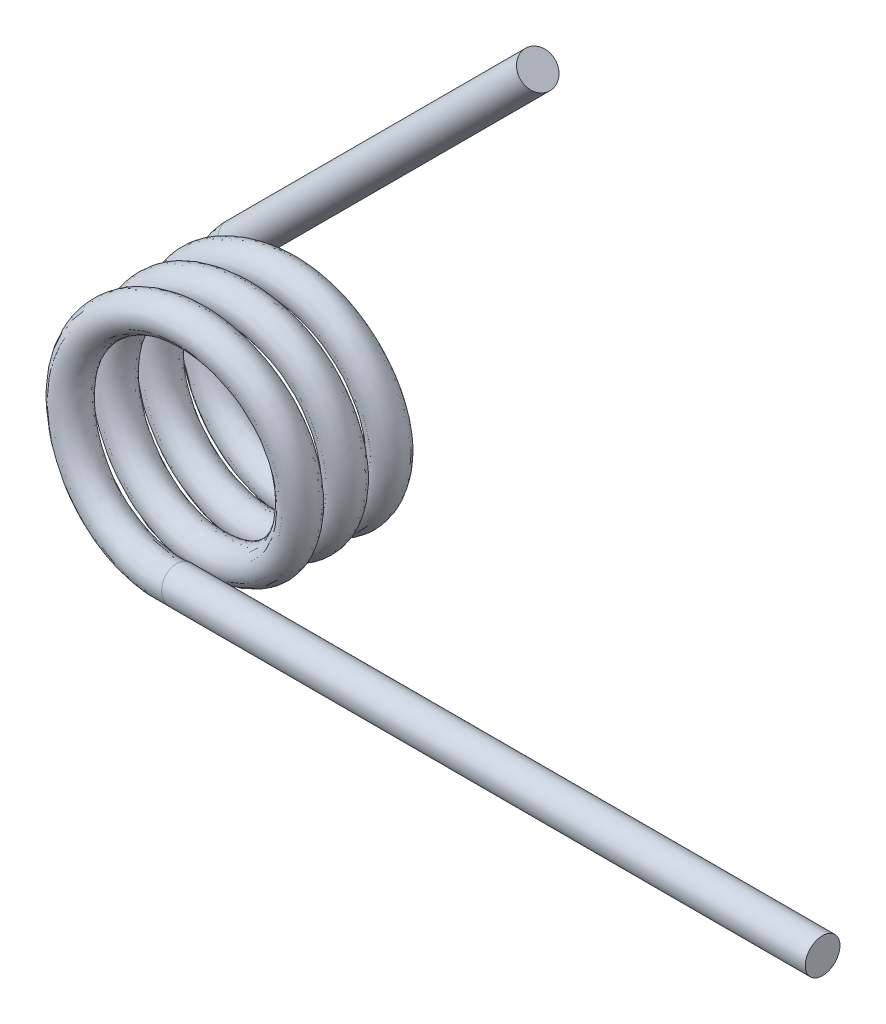
ISO-10303-21;
HEADER;
FILE_DESCRIPTION(('STEP AP214'),'2;1');
FILE_NAME('part.step','',(''),(''),'','','');
FILE_SCHEMA(('AUTOMOTIVE_DESIGN { 1 0 10303 214 1 1 1 1 }'));
ENDSEC;
DATA;
#1=APPLICATION_CONTEXT('core data for automotive mechanical design processes');
#2=APPLICATION_PROTOCOL_DEFINITION('international standard','automotive_design',2000,#1);
#3=PRODUCT_CONTEXT('',#1,'mechanical');
#4=PRODUCT('Part','Part','',(#3));
#5=PRODUCT_RELATED_PRODUCT_CATEGORY('part','',(#4));
#6=PRODUCT_DEFINITION_FORMATION('','',#4);
#7=PRODUCT_DEFINITION_CONTEXT('part definition',#1,'design');
#8=PRODUCT_DEFINITION('design','',#6,#7);
#9=PRODUCT_DEFINITION_SHAPE('','',#8);
#10=(LENGTH_UNIT() NAMED_UNIT(*) SI_UNIT(.MILLI.,.METRE.));
#11=(NAMED_UNIT(*) PLANE_ANGLE_UNIT() SI_UNIT($,.RADIAN.));
#12=(NAMED_UNIT(*) SI_UNIT($,.STERADIAN.) SOLID_ANGLE_UNIT());
#13=UNCERTAINTY_MEASURE_WITH_UNIT(LENGTH_MEASURE(1.E-05),#10,'distance_accuracy_value','');
#14=(GEOMETRIC_REPRESENTATION_CONTEXT(3) GLOBAL_UNCERTAINTY_ASSIGNED_CONTEXT((#13)) GLOBAL_UNIT_ASSIGNED_CONTEXT((#10,
#11,#12)) REPRESENTATION_CONTEXT('',''));
#15=CARTESIAN_POINT('',(0.,0.,0.));
#16=DIRECTION('',(0.,0.,1.));
#17=DIRECTION('',(1.,0.,0.));
#18=AXIS2_PLACEMENT_3D('',#15,#16,#17);
#19=CARTESIAN_POINT('',(18.6300268586095,-2.8765772246113,4.255));
#20=DIRECTION('',(1.,0.,0.));
#21=DIRECTION('',(0.,0.,-1.));
#22=AXIS2_PLACEMENT_3D('',#19,#20,#21);
#23=PLANE('',#22);
#24=CARTESIAN_POINT('',(18.6300268586095,-2.8765772246113,4.255));
#25=DIRECTION('',(1.,0.,0.));
#26=DIRECTION('',(0.,0.,-1.));
#27=AXIS2_PLACEMENT_3D('',#24,#25,#26);
#28=CIRCLE('',#27,0.4895);
#29=CARTESIAN_POINT('',(18.6300268586095,-2.8765772246113,3.7655));
#30=VERTEX_POINT('',#29);
#31=EDGE_CURVE('E63',#30,#30,#28,.T.);
#32=ORIENTED_EDGE('',*,*,#31,.T.);
#33=EDGE_LOOP('',(#32));
#34=FACE_BOUND('',#33,.T.);
#35=ADVANCED_FACE('F39',(#34),#23,.T.);
#36=CARTESIAN_POINT('',(6.34628336114918,10.4828580310906,0.));
#37=DIRECTION('',(-0.707106781186541,-0.707106781186554,0.));
#38=DIRECTION('',(-0.00427329936230746,0.00427329936230736,-0.999981738745827));
#39=AXIS2_PLACEMENT_3D('',#36,#37,#38);
#40=PLANE('',#39);
#41=CARTESIAN_POINT('',(6.34628336114918,10.4828580310906,0.));
#42=DIRECTION('',(-0.707106781186541,-0.707106781186554,0.));
#43=DIRECTION('',(-0.00427329936230746,0.00427329936230736,-0.999981738745827));
#44=AXIS2_PLACEMENT_3D('',#41,#42,#43);
#45=CIRCLE('',#44,0.4895);
#46=CARTESIAN_POINT('',(6.34419158111133,10.4849498111285,-0.489491061116082));
#47=VERTEX_POINT('',#46);
#48=EDGE_CURVE('E48',#47,#47,#45,.T.);
#49=ORIENTED_EDGE('',*,*,#48,.F.);
#50=EDGE_LOOP('',(#49));
#51=FACE_BOUND('',#50,.T.);
#52=ADVANCED_FACE('F75',(#51),#40,.F.);
#53=CARTESIAN_POINT('',(0.530026858609534,-2.8765772246113,4.255));
#54=DIRECTION('',(1.,0.,0.));
#55=DIRECTION('',(0.,0.,-1.));
#56=AXIS2_PLACEMENT_3D('',#53,#54,#55);
#57=CYLINDRICAL_SURFACE('',#56,0.4895);
#58=ORIENTED_EDGE('',*,*,#31,.F.);
#59=EDGE_LOOP('',(#58));
#60=FACE_BOUND('',#59,.T.);
#61=CARTESIAN_POINT('',(0.530026858609544,-2.8765772246113,4.255));
#62=DIRECTION('',(0.981178342847991,0.180788080481897,0.0678581570759287));
#63=DIRECTION('',(0.0678581570759287,0.00619224715790136,-0.997675762256152));
#64=AXIS2_PLACEMENT_3D('',#61,#62,#63);
#65=CIRCLE('',#64,0.4895);
#66=CARTESIAN_POINT('',(0.563243426498211,-2.87354611962751,3.76663771437562));
#67=VERTEX_POINT('',#66);
#68=EDGE_CURVE('E42',#67,#67,#65,.T.);
#69=ORIENTED_EDGE('',*,*,#68,.T.);
#70=EDGE_LOOP('',(#69));
#71=FACE_BOUND('',#70,.T.);
#72=ADVANCED_FACE('F77',(#60,#71),#57,.T.);
#73=CARTESIAN_POINT('',(-2.0938663464962,2.0468918835208,-0.488362773792839));
#74=CARTESIAN_POINT('',(-2.36763342569434,1.76698969350322,-0.461760612571226));
#75=CARTESIAN_POINT('',(-2.57930809249891,1.43762669824452,-0.435682391474214));
#76=CARTESIAN_POINT('',(-3.15249778585969,-0.00102496778021607,-0.330430426000548));
#77=CARTESIAN_POINT('',(-2.85782242619199,-1.32220134997787,-0.251926776694797));
#78=CARTESIAN_POINT('',(-1.25203658348134,-2.85101502267109,-0.101270119622918));
#79=CARTESIAN_POINT('',(-0.0604242902565774,-3.11369932529708,-0.0286574805579852));
#80=CARTESIAN_POINT('',(2.13432822452708,-2.36639687762337,0.128869944572521));
#81=CARTESIAN_POINT('',(2.98130588913432,-1.11939078305545,0.21448154326887));
#82=CARTESIAN_POINT('',(2.87345510542524,1.28654657242071,0.378134932126369));
#83=CARTESIAN_POINT('',(2.05808697179071,2.38071671336757,0.457593503653895));
#84=CARTESIAN_POINT('',(-0.119138685124309,3.14536577666903,0.614400189575746));
#85=CARTESIAN_POINT('',(-1.43715794829883,2.80172127515322,0.693654117318446));
#86=CARTESIAN_POINT('',(-2.96587828050796,1.05967502675516,0.851147056295941));
#87=CARTESIAN_POINT('',(-3.13848898695276,-0.281783258475423,0.929619655257181));
#88=CARTESIAN_POINT('',(-2.08753667374326,-2.36127644816065,1.08794717106365));
#89=CARTESIAN_POINT('',(-0.913493025789077,-3.01698691823009,1.16578595403689));
#90=CARTESIAN_POINT('',(1.41414642293534,-2.81794700477442,1.3245318632749));
#91=CARTESIAN_POINT('',(2.45816323923827,-1.9723965030003,1.40226748309654));
#92=CARTESIAN_POINT('',(3.14171996712435,0.25821616377214,1.56080033938955));
#93=CARTESIAN_POINT('',(2.7433028005917,1.54746229749711,1.63901849602975));
#94=CARTESIAN_POINT('',(0.937723758925465,3.0074414679008,1.79680354292195));
#95=CARTESIAN_POINT('',(-0.416875224311723,3.11971412106547,1.87582502716098));
#96=CARTESIAN_POINT('',(-2.35046699324849,2.04244927330612,2.0262329726745));
#97=CARTESIAN_POINT('',(-2.9552146592131,0.982596397929943,2.09884259374825));
#98=CARTESIAN_POINT('',(-2.89357061012604,-1.33507673320053,2.25636986962714));
#99=CARTESIAN_POINT('',(-1.95443834232406,-2.51423770137044,2.34198154492577));
#100=CARTESIAN_POINT('',(0.374942016447505,-3.12591822351663,2.50563493084736));
#101=CARTESIAN_POINT('',(1.66192457148714,-2.67236613698577,2.5850935036745));
#102=CARTESIAN_POINT('',(3.03878740385889,-0.820543118788447,2.74190018955335));
#103=CARTESIAN_POINT('',(3.10215997265134,0.540063448501195,2.82115411699546));
#104=CARTESIAN_POINT('',(1.89283534980621,2.51724437554665,2.97864704910346));
#105=CARTESIAN_POINT('',(0.663196717179051,3.08053351579807,3.05711969521312));
#106=CARTESIAN_POINT('',(-1.63461243445009,2.69471215925458,3.21544703659947));
#107=CARTESIAN_POINT('',(-2.60946739310408,1.7684308205641,3.29328490837826));
#108=CARTESIAN_POINT('',(-3.11124349417794,-0.515234164071165,3.45216947848876));
#109=CARTESIAN_POINT('',(-2.60851799490417,-1.76452225700017,3.53018542597519));
#110=CARTESIAN_POINT('',(-1.01468846748341,-2.8529502482395,3.66131311683812));
#111=CARTESIAN_POINT('',(-0.205625051166704,-3.02404320636376,3.71339912367885));
#112=CARTESIAN_POINT('',(0.56324342649821,-2.87354611962751,3.76663771437562));
#113=CARTESIAN_POINT('',(-1.91271137806017,1.86558827132122,-0.489908125800683));
#114=CARTESIAN_POINT('',(-2.16164651245068,1.61049761825705,-0.46341680810756));
#115=CARTESIAN_POINT('',(-2.35529702666768,1.30850063629937,-0.437133681168645));
#116=CARTESIAN_POINT('',(-2.87609209441093,-0.00284212051756129,-0.332400221105445));
#117=CARTESIAN_POINT('',(-2.60538720750368,-1.21030911165802,-0.253234696870722));
#118=CARTESIAN_POINT('',(-1.14040320484488,-2.60195615883937,-0.103063555250952));
#119=CARTESIAN_POINT('',(-0.0519531541739385,-2.84124303274397,-0.0302276290921996));
#120=CARTESIAN_POINT('',(1.95024747857444,-2.1569801974874,0.127364439607384));
#121=CARTESIAN_POINT('',(2.72144800732195,-1.01690606579414,0.213205811403368));
#122=CARTESIAN_POINT('',(2.62071749961187,1.17557077207754,0.37630070991663));
#123=CARTESIAN_POINT('',(1.87424665379275,2.17489828790497,0.456294821951415));
#124=CARTESIAN_POINT('',(-0.110686160210887,2.86952939701158,0.612566389133459));
#125=CARTESIAN_POINT('',(-1.31513068835853,2.55401477617731,0.692356517049048));
#126=CARTESIAN_POINT('',(-2.70651989239745,0.964894716470479,0.849312073128396));
#127=CARTESIAN_POINT('',(-2.86289266654269,-0.261545599078676,0.928323500470885));
#128=CARTESIAN_POINT('',(-1.90302325065485,-2.15556886815268,1.08611078378463));
#129=CARTESIAN_POINT('',(-0.829093891905757,-2.75374526957869,1.1644905974633));
#130=CARTESIAN_POINT('',(1.29193571881643,-2.56999151450873,1.32269476918038));
#131=CARTESIAN_POINT('',(2.24543121701114,-1.79594574801056,1.40097178505933));
#132=CARTESIAN_POINT('',(2.86610685250119,0.237557759130508,1.55896368152844));
#133=CARTESIAN_POINT('',(2.5005588329176,1.41568122634267,1.63772154058003));
#134=CARTESIAN_POINT('',(0.85360961957822,2.74436052959318,1.79496822285864));
#135=CARTESIAN_POINT('',(-0.384759293436816,2.84557971317633,1.87452668234068));
#136=CARTESIAN_POINT('',(-2.14579224530378,1.86187939018211,2.02442136573558));
#137=CARTESIAN_POINT('',(-2.69757205612254,0.893576817124477,2.09727160978748));
#138=CARTESIAN_POINT('',(-2.63892644891741,-1.22150989155184,2.25486526476646));
#139=CARTESIAN_POINT('',(-1.77939073572622,-2.29655084149123,2.34070581451554));
#140=CARTESIAN_POINT('',(0.344048745140703,-2.85162362034263,2.50380070104746));
#141=CARTESIAN_POINT('',(1.52000407335801,-2.4356869046004,2.58379482198591));
#142=CARTESIAN_POINT('',(2.7728902732702,-0.746679260821541,2.7400663891396));
#143=CARTESIAN_POINT('',(2.82938665021835,0.497123073211611,2.81985651874263));
#144=CARTESIAN_POINT('',(1.72529275916328,2.29774595081289,2.97681206538323));
#145=CARTESIAN_POINT('',(0.600657404817982,2.81136494116315,3.05582336270667));
#146=CARTESIAN_POINT('',(-1.49299787585572,2.45742310282239,3.213610724988));
#147=CARTESIAN_POINT('',(-2.38317762355383,1.60964196088404,3.29199577523885));
#148=CARTESIAN_POINT('',(-2.83813638944651,-0.47200931920661,3.45032914150828));
#149=CARTESIAN_POINT('',(-2.37740141254255,-1.61345103311367,3.52880468599672));
#150=CARTESIAN_POINT('',(-0.923496194654531,-2.6039366984286,3.65959692027169));
#151=CARTESIAN_POINT('',(-0.184252270281751,-2.75954017236415,3.71193783252807));
#152=CARTESIAN_POINT('',(0.516907152091288,-2.62147283397314,3.76505063151739));
#153=CARTESIAN_POINT('',(-1.73569996977945,1.71082030980437,-0.258657555336103));
#154=CARTESIAN_POINT('',(-1.96336073003026,1.47990903093087,-0.23226717436363));
#155=CARTESIAN_POINT('',(-2.14235716707522,1.20417292472552,-0.205797438579681));
#156=CARTESIAN_POINT('',(-2.62261736638395,0.012426811857812,-0.101538207095982));
#157=CARTESIAN_POINT('',(-2.3813791876143,-1.09246239529204,-0.0217667774984298));
#158=CARTESIAN_POINT('',(-1.05344888506516,-2.36692478415878,0.127959700359682));
#159=CARTESIAN_POINT('',(-0.0610227120771452,-2.59130830002005,0.201000784898506));
#160=CARTESIAN_POINT('',(1.76882537752534,-1.97669732362203,0.358650770837577));
#161=CARTESIAN_POINT('',(2.47750727291636,-0.939128680220442,0.44470305244782));
#162=CARTESIAN_POINT('',(2.39596967938059,1.05836736879257,0.60728669074003));
#163=CARTESIAN_POINT('',(1.7187506728459,1.97536646740859,0.687771053348321));
#164=CARTESIAN_POINT('',(-0.0859980725996869,2.61732059826558,0.843552756632553));
#165=CARTESIAN_POINT('',(-1.18831125927818,2.33496084919071,0.923833737558957));
#166=CARTESIAN_POINT('',(-2.463066951354,0.893985286460996,1.08029735878935));
#167=CARTESIAN_POINT('',(-2.61207966560256,-0.226109468439607,1.15980204425497));
#168=CARTESIAN_POINT('',(-1.74660129253814,-1.95576038241741,1.3170947840441));
#169=CARTESIAN_POINT('',(-0.768071788020467,-2.50780549142793,1.39596987306248));
#170=CARTESIAN_POINT('',(1.16473308216294,-2.35031299120139,1.55367812129217));
#171=CARTESIAN_POINT('',(2.0400327091914,-1.64763268804902,1.63245074944741));
#172=CARTESIAN_POINT('',(2.61485053845901,0.201701615452943,1.78994743160695));
#173=CARTESIAN_POINT('',(2.28664288343039,1.28024640518931,1.86919935428674));
#174=CARTESIAN_POINT('',(0.792701207041617,2.49815194977488,2.02595319720638));
#175=CARTESIAN_POINT('',(-0.338547827893222,2.59683217358306,2.10600322351708));
#176=CARTESIAN_POINT('',(-1.94717469263065,1.70902790948982,2.25542804856905));
#177=CARTESIAN_POINT('',(-2.45622343296831,0.827996045993654,2.32849925992074));
#178=CARTESIAN_POINT('',(-2.41289166465284,-1.10182779507024,2.48615242272121));
#179=CARTESIAN_POINT('',(-1.63266333862859,-2.08672359863677,2.57220305678615));
#180=CARTESIAN_POINT('',(0.298894827420089,-2.60220560667885,2.73478667497783));
#181=CARTESIAN_POINT('',(1.37566698469447,-2.22794005780839,2.81527105339683));
#182=CARTESIAN_POINT('',(2.52473164479271,-0.695336540046456,2.97105275666385));
#183=CARTESIAN_POINT('',(2.58254918096621,0.441095821282932,3.05133374111085));
#184=CARTESIAN_POINT('',(1.58526820443052,2.0863444278407,3.20779735051642));
#185=CARTESIAN_POINT('',(0.559992266535262,2.56134634493135,3.28730174294235));
#186=CARTESIAN_POINT('',(-1.34867182081602,2.24870992396111,3.44459479610573));
#187=CARTESIAN_POINT('',(-2.16646987213281,1.47831625390584,3.52348077597312));
#188=CARTESIAN_POINT('',(-2.59055914127107,-0.415631808474069,3.68130947017576));
#189=CARTESIAN_POINT('',(-2.17525984626743,-1.46102755337379,3.76020556519815));
#190=CARTESIAN_POINT('',(-0.855315111816955,-2.37024593988615,3.89069135978841));
#191=CARTESIAN_POINT('',(-0.181068547695663,-2.51618605765498,3.9432308918658));
#192=CARTESIAN_POINT('',(0.458923247489737,-2.39356562855337,3.99626300021489));
#193=CARTESIAN_POINT('',(-1.70891369154788,1.73322557416939,0.252754745475336));
#194=CARTESIAN_POINT('',(-1.93947548093307,1.50583999575423,0.279142465996874));
#195=CARTESIAN_POINT('',(-2.12230724498259,1.23309792163392,0.305615057101753));
#196=CARTESIAN_POINT('',(-2.6182552978191,0.0496243992379974,0.409868877637214));
#197=CARTESIAN_POINT('',(-2.3938481829686,-1.05720305240902,0.489648423419006));
#198=CARTESIAN_POINT('',(-1.08557769794335,-2.34841017039694,0.639368498076639));
#199=CARTESIAN_POINT('',(-0.097901160596224,-2.58682884610208,0.712413975687198));
#200=CARTESIAN_POINT('',(1.73819532519746,-1.99924332281224,0.870061984804301));
#201=CARTESIAN_POINT('',(2.46100665710745,-0.973132375063701,0.956118329940038));
#202=CARTESIAN_POINT('',(2.40741726276449,1.02268924346681,1.11869512634797));
#203=CARTESIAN_POINT('',(1.74462905871406,1.94840403876247,1.19918604832843));
#204=CARTESIAN_POINT('',(-0.0486351995883971,2.61460259847011,1.35496119867074));
#205=CARTESIAN_POINT('',(-1.15359866275751,2.34886220491895,1.43524874388262));
#206=CARTESIAN_POINT('',(-2.44663958722763,0.927676909092079,1.5917057882453));
#207=CARTESIAN_POINT('',(-2.61194970912424,-0.188691139342879,1.67121706835703));
#208=CARTESIAN_POINT('',(-1.77179045924972,-1.92796811337153,1.82850319622795));
#209=CARTESIAN_POINT('',(-0.802734804914021,-2.49367822723435,1.9073849093758));
#210=CARTESIAN_POINT('',(1.1295450293411,-2.36333937808632,2.06508652238322));
#211=CARTESIAN_POINT('',(2.01400166212738,-1.67452102835436,2.14386578459801));
#212=CARTESIAN_POINT('',(2.61377970525409,0.164201528530117,2.30135583502232));
#213=CARTESIAN_POINT('',(2.30191318080836,1.24610357573387,2.38061437490069));
#214=CARTESIAN_POINT('',(0.827044144579985,2.48311240065352,2.53736161614438));
#215=CARTESIAN_POINT('',(-0.301200325280759,2.59831856944755,2.61741822567233));
#216=CARTESIAN_POINT('',(-1.91993459947434,1.73417841274055,2.76683675959064));
#217=CARTESIAN_POINT('',(-2.44099008838572,0.8618793586765,2.8399124424963));
#218=CARTESIAN_POINT('',(-2.42532342910359,-1.06588323268243,2.99756365373594));
#219=CARTESIAN_POINT('',(-1.66023089432619,-2.06086723829129,3.08361833406358));
#220=CARTESIAN_POINT('',(0.261426645983301,-2.60253859588495,3.2461951106138));
#221=CARTESIAN_POINT('',(1.34223456087372,-2.24464144848416,3.32668604837757));
#222=CARTESIAN_POINT('',(2.51103799632869,-0.73020566386847,3.48246119870267));
#223=CARTESIAN_POINT('',(2.58551201180306,0.403820714964622,3.56274874748643));
#224=CARTESIAN_POINT('',(1.61255952769664,2.06065070591953,3.7192057799174));
#225=CARTESIAN_POINT('',(0.595683141919077,2.55010711127671,3.79871676298107));
#226=CARTESIAN_POINT('',(-1.31465177139353,2.26450682760301,3.95600321271201));
#227=CARTESIAN_POINT('',(-2.1426949961118,1.50722141804533,4.03489595007606));
#228=CARTESIAN_POINT('',(-2.59256339756413,-0.378155722702984,4.1927177110808));
#229=CARTESIAN_POINT('',(-2.19315713955649,-1.42812154502819,4.27161904190298));
#230=CARTESIAN_POINT('',(-0.887827954109313,-2.35458756275449,4.4021021517186));
#231=CARTESIAN_POINT('',(-0.216823266073335,-2.51025178050436,4.45463092878438));
#232=CARTESIAN_POINT('',(0.424138938937568,-2.39673979426982,4.50767478981753));
#233=CARTESIAN_POINT('',(-1.86155335500911,1.90837917422089,0.486817421784996));
#234=CARTESIAN_POINT('',(-2.11602482289003,1.66002393354117,0.513303473906599));
#235=CARTESIAN_POINT('',(-2.31700449615243,1.36374331114223,0.539592238591511));
#236=CARTESIAN_POINT('',(-2.8677611571189,0.0682000383137258,0.644315364503996));
#237=CARTESIAN_POINT('',(-2.62920123445589,-1.14296872713713,0.723496389509345));
#238=CARTESIAN_POINT('',(-1.20176471746786,-2.56659585124452,0.873655301917157));
#239=CARTESIAN_POINT('',(-0.12238580267888,-2.8326879059431,0.946499618224684));
#240=CARTESIAN_POINT('',(1.89174838775325,-2.20003988410433,1.10408791147273));
#241=CARTESIAN_POINT('',(2.689934152481,-1.08184833920788,1.18993704403149));
#242=CARTESIAN_POINT('',(2.64258077339626,1.10743057200868,1.35301887550654));
#243=CARTESIAN_POINT('',(1.92367073014806,2.12340384234342,1.43302551501936));
#244=CARTESIAN_POINT('',(-0.0393283290699674,2.86433839977836,1.58928456700595));
#245=CARTESIAN_POINT('',(-1.24883451247021,2.58056440993261,1.66908723178203));
#246=CARTESIAN_POINT('',(-2.67514593796774,1.02924097586342,1.82603022697016));
#247=CARTESIAN_POINT('',(-2.86264446795129,-0.190081854623129,1.90505424915835));
#248=CARTESIAN_POINT('',(-1.9511310153895,-2.10248954417173,2.06282890463887));
#249=CARTESIAN_POINT('',(-0.895295377671533,-2.72676418243382,2.1412213694716));
#250=CARTESIAN_POINT('',(1.22473148827666,-2.5948700808687,2.29941286884988));
#251=CARTESIAN_POINT('',(2.19571557924286,-1.8472986952666,2.37770255484869));
#252=CARTESIAN_POINT('',(2.86406171172681,0.165937868731229,2.53568178563537));
#253=CARTESIAN_POINT('',(2.52972295264003,1.35047322539631,2.61445228260683));
#254=CARTESIAN_POINT('',(0.919199798812371,2.71563710657737,2.7716863566112));
#255=CARTESIAN_POINT('',(-0.313430817606863,2.84841852016765,2.85125738911196));
#256=CARTESIAN_POINT('',(-2.09376749958588,1.90991331314477,3.00114005732862));
#257=CARTESIAN_POINT('',(-2.66847851104117,0.958289177548453,3.07399884141844));
#258=CARTESIAN_POINT('',(-2.66266937008131,-1.15286083417907,3.23158876919109));
#259=CARTESIAN_POINT('',(-1.83204088882639,-2.24716883077956,3.31743704673349));
#260=CARTESIAN_POINT('',(0.272489789730017,-2.85225958287994,3.48051886669087));
#261=CARTESIAN_POINT('',(1.45615284723034,-2.4675842111929,3.56052551505606));
#262=CARTESIAN_POINT('',(2.74673733116635,-0.813274381830415,3.7167845670123));
#263=CARTESIAN_POINT('',(2.83504524029673,0.4259328641117,3.79658723357458));
#264=CARTESIAN_POINT('',(1.77741534717953,2.24867455661259,3.9535302191202));
#265=CARTESIAN_POINT('',(0.668821955710277,2.78989958605012,4.0325541036348));
#266=CARTESIAN_POINT('',(-1.42802436750286,2.48759296642488,4.19032885428739));
#267=CARTESIAN_POINT('',(-2.33777095507286,1.6648467579338,4.26872681040668));
#268=CARTESIAN_POINT('',(-2.84196423700095,-0.400435267633742,4.42704693524427));
#269=CARTESIAN_POINT('',(-2.41158272488076,-1.55060518648679,4.5055324793726));
#270=CARTESIAN_POINT('',(-0.985591149432634,-2.57403140097259,4.63631958610695));
#271=CARTESIAN_POINT('',(-0.252537901463087,-2.74824822812606,4.68864202056187));
#272=CARTESIAN_POINT('',(0.450474016313953,-2.62753504394072,4.74177520276617));
#273=CARTESIAN_POINT('',(-2.22386329188117,2.27098639862005,0.489908125800685));
#274=CARTESIAN_POINT('',(-2.52799157346847,1.97301113269112,0.516615694565348));
#275=CARTESIAN_POINT('',(-2.76502662781489,1.62199543503252,0.542494817980538));
#276=CARTESIAN_POINT('',(-3.42057254001641,0.0718343437884159,0.648254954713285));
#277=CARTESIAN_POINT('',(-3.1340716718325,-1.36675320377683,0.726112229861697));
#278=CARTESIAN_POINT('',(-1.42503147474077,-3.06471357890795,0.877242173172767));
#279=CARTESIAN_POINT('',(-0.139328074844158,-3.37760049104932,0.949639915293113));
#280=CARTESIAN_POINT('',(2.25990987965853,-2.61887324437628,1.107098921403));
#281=CARTESIAN_POINT('',(3.20964991610573,-1.28681777373049,1.19248850776195));
#282=CARTESIAN_POINT('',(3.148055985023,1.32938217269502,1.35668731992652));
#283=CARTESIAN_POINT('',(2.29135136614396,2.53504069326863,1.43562287842383));
#284=CARTESIAN_POINT('',(-0.0562333788968112,3.41601115909327,1.59295216789103));
#285=CARTESIAN_POINT('',(-1.49288903235082,3.07597740788443,1.67168243232032));
#286=CARTESIAN_POINT('',(-3.19386271418877,1.21880159643278,1.82970019330575));
#287=CARTESIAN_POINT('',(-3.41383710877141,-0.230557173416624,1.90764655873045));
#288=CARTESIAN_POINT('',(-2.32015786156632,-2.51390470418767,2.06650167919741));
#289=CARTESIAN_POINT('',(-1.06409364543817,-3.25324747973662,2.14381208261879));
#290=CARTESIAN_POINT('',(1.46915289651447,-3.09078106140007,2.30308705703892));
#291=CARTESIAN_POINT('',(2.62117962369712,-2.20020020524607,2.38029395092311));
#292=CARTESIAN_POINT('',(3.41528794097314,0.207254678014491,2.53935510135758));
#293=CARTESIAN_POINT('',(3.01521088798822,1.61403536770521,2.61704619350628));
#294=CARTESIAN_POINT('',(1.08742807750686,3.24179898319261,2.77535699673781));
#295=CARTESIAN_POINT('',(-0.377662679356677,3.39668733594592,2.85385407875306));
#296=CARTESIAN_POINT('',(-2.50311699547531,2.2710530793928,3.00476327120599));
#297=CARTESIAN_POINT('',(-3.18376371722229,1.13632833915938,3.07714080934089));
#298=CARTESIAN_POINT('',(-3.17195769249858,-1.37999451747645,3.23459797891136));
#299=CARTESIAN_POINT('',(-2.18213610202205,-2.68254255053851,3.31998850755396));
#300=CARTESIAN_POINT('',(0.334276332343621,-3.40084878922744,3.48418732629068));
#301=CARTESIAN_POINT('',(1.7399938434886,-2.94094267596362,3.56312287843324));
#302=CARTESIAN_POINT('',(3.27853159234373,-0.961002097764227,3.72045216783979));
#303=CARTESIAN_POINT('',(3.3805918851627,0.511813614690869,3.79918243008072));
#304=CARTESIAN_POINT('',(2.11250052846539,2.6876714060801,3.95720018656015));
#305=CARTESIAN_POINT('',(0.793900580432415,3.32823673531969,4.03514676864719));
#306=CARTESIAN_POINT('',(-1.71125348469158,2.96217107928949,4.19400147751083));
#307=CARTESIAN_POINT('',(-2.79035049417336,1.98242447729392,4.2713050766855));
#308=CARTESIAN_POINT('',(-3.3881784464638,-0.486884957362851,4.43072760920524));
#309=CARTESIAN_POINT('',(-2.87381588960401,-1.85274763425978,4.50829395932903));
#310=CARTESIAN_POINT('',(-1.1679756950904,-3.07205850059437,4.63975197924014));
#311=CARTESIAN_POINT('',(-0.295282029343233,-3.27732407870221,4.69156813675991));
#312=CARTESIAN_POINT('',(0.543146565127797,-3.13168161524947,4.74494936848261));
#313=CARTESIAN_POINT('',(-2.40087470016189,2.4257543601369,0.258657555336104));
#314=CARTESIAN_POINT('',(-2.72627721545108,2.10360013142994,0.28546806411756));
#315=CARTESIAN_POINT('',(-2.97796648740735,1.72632314660704,0.311158575391242));
#316=CARTESIAN_POINT('',(-3.67404726804339,0.0565654114110313,0.417392940704828));
#317=CARTESIAN_POINT('',(-3.35807969172188,-1.48459992014281,0.494644310487898));
#318=CARTESIAN_POINT('',(-1.51198579452049,-3.29974495358854,0.646218917563505));
#319=CARTESIAN_POINT('',(-0.130258516940952,-3.6275352237737,0.718411501301485));
#320=CARTESIAN_POINT('',(2.44133198070764,-2.7991561182411,0.875812590173903));
#321=CARTESIAN_POINT('',(3.45359065051132,-1.36459515930202,0.96099126671804));
#322=CARTESIAN_POINT('',(3.37280380525428,1.44658557597798,1.12570133910262));
#323=CARTESIAN_POINT('',(2.44684734709082,2.734572513765,1.20414664702692));
#324=CARTESIAN_POINT('',(-0.0809214665080115,3.66821995783927,1.36196580039193));
#325=CARTESIAN_POINT('',(-1.61970846143317,3.29503133487003,1.44020521181092));
#326=CARTESIAN_POINT('',(-3.43731565523022,1.28971102644327,1.5987149076443));
#327=CARTESIAN_POINT('',(-3.66465010971255,-0.26599330405368,1.67616801494687));
#328=CARTESIAN_POINT('',(-2.47657981968203,-2.71371318992495,1.83551767893744));
#329=CARTESIAN_POINT('',(-1.12511574931944,-3.49918725788814,1.9123328070186));
#330=CARTESIAN_POINT('',(1.59635553316394,-3.31045958470667,2.07210370492814));
#331=CARTESIAN_POINT('',(2.82657813151686,-2.34851326520561,2.14881498653502));
#332=CARTESIAN_POINT('',(3.66654425501531,0.243110821690046,2.30837135127907));
#333=CARTESIAN_POINT('',(3.22912683747443,1.74947018885857,2.38556837980007));
#334=CARTESIAN_POINT('',(1.14833649004447,3.48800756301091,2.54437202238957));
#335=CARTESIAN_POINT('',(-0.423874144902276,3.64543487553869,2.62237753757666));
#336=CARTESIAN_POINT('',(-2.70173454814661,2.42390456008554,2.77375658837252));
#337=CARTESIAN_POINT('',(-3.42511234037629,1.2019091102902,2.84591315920625));
#338=CARTESIAN_POINT('',(-3.39799247676342,-1.49967661395805,3.00331082095825));
#339=CARTESIAN_POINT('',(-2.32886349911968,-2.89236979339298,3.08849126528389));
#340=CARTESIAN_POINT('',(0.379430250064235,-3.65026680289122,3.25320135235981));
#341=CARTESIAN_POINT('',(1.88433093215314,-3.14868952275563,3.33164664702281));
#342=CARTESIAN_POINT('',(3.52669022082022,-1.01234481853931,3.48946580031504));
#343=CARTESIAN_POINT('',(3.62742935441384,0.567840866619547,3.5677052077125));
#344=CARTESIAN_POINT('',(2.25252508319915,2.89907292905229,3.72621490142696));
#345=CARTESIAN_POINT('',(0.834565718717144,3.57825533155149,3.80366838841252));
#346=CARTESIAN_POINT('',(-1.8555795397333,3.17088425815078,3.9630174063921));
#347=CARTESIAN_POINT('',(-3.00705824559337,2.11375018427413,4.03982007595122));
#348=CARTESIAN_POINT('',(-3.63575569464025,-0.543262468097405,4.19974728053776));
#349=CARTESIAN_POINT('',(-3.07595745587812,-2.00517111400066,4.2768930801276));
#350=CARTESIAN_POINT('',(-1.23615677792864,-3.30574925913616,4.40865753972342));
#351=CARTESIAN_POINT('',(-0.298460136421866,-3.52068093228094,4.46022616796275));
#352=CARTESIAN_POINT('',(0.601130469729344,-3.35958882066923,4.51373699978511));
#353=CARTESIAN_POINT('',(-2.42766097839346,2.40334909577188,-0.252754745475335));
#354=CARTESIAN_POINT('',(-2.75016969333471,2.07766605183993,-0.225941380540385));
#355=CARTESIAN_POINT('',(-2.99801640949998,1.69739814969864,-0.200253920290192));
#356=CARTESIAN_POINT('',(-3.67840933660824,0.0193678240308465,-0.0940141440283671));
#357=CARTESIAN_POINT('',(-3.34561069636758,-1.51985926302583,-0.0167708904295374));
#358=CARTESIAN_POINT('',(-1.4798569816423,-3.31825956735038,0.13481011984655));
#359=CARTESIAN_POINT('',(-0.0933800684218727,-3.63201467769168,0.206998310512793));
#360=CARTESIAN_POINT('',(2.47196203303552,-2.77661011905089,0.364401376207178));
#361=CARTESIAN_POINT('',(3.47009126632023,-1.33059146445877,0.449575989225823));
#362=CARTESIAN_POINT('',(3.36135622187038,1.48226370130375,0.61429290349468));
#363=CARTESIAN_POINT('',(2.42096896122266,2.76153494241112,0.692731652047312));
#364=CARTESIAN_POINT('',(-0.118284339519301,3.67093795763473,0.850557358353247));
#365=CARTESIAN_POINT('',(-1.65442105795385,3.28112997914179,0.928790205487248));
#366=CARTESIAN_POINT('',(-3.45374301935659,1.25601940381218,1.08730647818835));
#367=CARTESIAN_POINT('',(-3.66478006619087,-0.303411633150408,1.1647529908448));
#368=CARTESIAN_POINT('',(-2.45139065297045,-2.74150545897083,1.32410926675359));
#369=CARTESIAN_POINT('',(-1.09045273242588,-3.51331452208121,1.40091777070528));
#370=CARTESIAN_POINT('',(1.63154358598578,-3.29743319782224,1.56069530383708));
#371=CARTESIAN_POINT('',(2.85260917858139,-2.32162492490026,1.63739995138442));
#372=CARTESIAN_POINT('',(3.66761508821973,0.280610908612873,1.79696294786369));
#373=CARTESIAN_POINT('',(3.21385654009646,1.783613018314,1.87415335918562));
#374=CARTESIAN_POINT('',(1.1139935525061,3.50304711213227,2.03296360345207));
#375=CARTESIAN_POINT('',(-0.461221647514739,3.6439484796742,2.11096253542141));
#376=CARTESIAN_POINT('',(-2.72897464130293,2.39875405683481,2.26234787735093));
#377=CARTESIAN_POINT('',(-3.44034568495888,1.16802579760736,2.33449997663069));
#378=CARTESIAN_POINT('',(-3.38556071231267,-1.53562117634586,2.49189958994352));
#379=CARTESIAN_POINT('',(-2.30129594342209,-2.91822615373846,2.57707598800646));
#380=CARTESIAN_POINT('',(0.416898431501023,-3.64993381368512,2.74179291672384));
#381=CARTESIAN_POINT('',(1.9177633559739,-3.13198813207986,2.82023165204208));
#382=CARTESIAN_POINT('',(3.54038386928424,-0.977475694717296,2.97805735827622));
#383=CARTESIAN_POINT('',(3.62446652357699,0.605115972937858,3.05629020133743));
#384=CARTESIAN_POINT('',(2.22523375993303,2.92476665097346,3.21480647202547));
#385=CARTESIAN_POINT('',(0.79887484333132,3.58949456520639,3.2922533683733));
#386=CARTESIAN_POINT('',(-1.88959958915378,3.15508735450863,3.45160898978632));
#387=CARTESIAN_POINT('',(-3.03083312161438,2.08484502013465,3.52840490184829));
#388=CARTESIAN_POINT('',(-3.6337514383472,-0.58073855386849,3.68833903963272));
#389=CARTESIAN_POINT('',(-3.05806016258906,-2.03807712234626,3.76547960342277));
#390=CARTESIAN_POINT('',(-1.20364393563628,-3.32140763626782,3.89724674779323));
#391=CARTESIAN_POINT('',(-0.262706881580813,-3.52654390983511,3.94882253302848));
#392=CARTESIAN_POINT('',(0.635914778281513,-3.35641465495278,4.00232521018248));
#393=CARTESIAN_POINT('',(-2.27502131493223,2.22819549572038,-0.486817421784995));
#394=CARTESIAN_POINT('',(-2.57362033893801,1.9234817687494,-0.460104417034893));
#395=CARTESIAN_POINT('',(-2.80331915833014,1.56675276018967,-0.434231101779783));
#396=CARTESIAN_POINT('',(-3.42890347730844,0.00079218495712915,-0.328460630895652));
#397=CARTESIAN_POINT('',(-3.11025764488029,-1.43409358829772,-0.250618856518872));
#398=CARTESIAN_POINT('',(-1.3636699621178,-3.1000738865028,-0.0994766839948844));
#399=CARTESIAN_POINT('',(-0.0688954263392163,-3.38615561785019,-0.0270873320237708));
#400=CARTESIAN_POINT('',(2.31840897047972,-2.57581355775935,0.130375449537658));
#401=CARTESIAN_POINT('',(3.24116377094668,-1.22187550031676,0.215757275134372));
#402=CARTESIAN_POINT('',(3.12619271123861,1.39752237276389,0.379969154336108));
#403=CARTESIAN_POINT('',(2.24192728978866,2.58653513883017,0.458892185356375));
#404=CARTESIAN_POINT('',(-0.127591210037731,3.42120215632648,0.616233990018033));
#405=CARTESIAN_POINT('',(-1.55918520823914,3.04942777412913,0.694951717587843));
#406=CARTESIAN_POINT('',(-3.22523666861848,1.15445533703985,0.852982039463485));
#407=CARTESIAN_POINT('',(-3.41408530736282,-0.30202091787217,0.930915810043478));
#408=CARTESIAN_POINT('',(-2.27205009683167,-2.56698402816862,1.08978355834267));
#409=CARTESIAN_POINT('',(-0.997892159672397,-3.2802285668815,1.16708131061049));
#410=CARTESIAN_POINT('',(1.53635712705424,-3.0659024950401,1.32636895736942));
#411=CARTESIAN_POINT('',(2.6708952614654,-2.14884725799003,1.40356318113375));
#412=CARTESIAN_POINT('',(3.41733308174752,0.278874568413772,1.56263699725065));
#413=CARTESIAN_POINT('',(2.98604676826579,1.67924336865156,1.64031545147948));
#414=CARTESIAN_POINT('',(1.02183789827271,3.27052240620842,1.79863886298525));
#415=CARTESIAN_POINT('',(-0.44899115518663,3.3938485289546,1.87712337198128));
#416=CARTESIAN_POINT('',(-2.55514174119321,2.22301915643014,2.02804457961341));
#417=CARTESIAN_POINT('',(-3.21285726230366,1.07161597873541,2.10041357770901));
#418=CARTESIAN_POINT('',(-3.14821477133468,-1.44864357484923,2.25787447448782));
#419=CARTESIAN_POINT('',(-2.12948594892189,-2.73192456124964,2.34325727533601));
#420=CARTESIAN_POINT('',(0.405835287754306,-3.40021282669063,2.50746916064727));
#421=CARTESIAN_POINT('',(1.80384506961627,-2.90904536937113,2.58639218536309));
#422=CARTESIAN_POINT('',(3.30468453444758,-0.894406976755353,2.74373398996709));
#423=CARTESIAN_POINT('',(3.37493329508432,0.583003823790779,2.82245171524828));
#424=CARTESIAN_POINT('',(2.06037794044914,2.7367428002804,2.98048203282369));
#425=CARTESIAN_POINT('',(0.72573602954012,3.34970209043298,3.05841602771957));
#426=CARTESIAN_POINT('',(-1.77622699304445,2.93200121568676,3.21728334821094));
#427=CARTESIAN_POINT('',(-2.83575716265433,1.92721968024416,3.29457404151766));
#428=CARTESIAN_POINT('',(-3.38435059890937,-0.55845900893572,3.45400981546924));
#429=CARTESIAN_POINT('',(-2.83963457726579,-1.91559348088666,3.53156616595365));
#430=CARTESIAN_POINT('',(-1.10588074031229,-3.10196379805039,3.66302931340454));
#431=CARTESIAN_POINT('',(-0.226997832051657,-3.28854624036337,3.71486041482963));
#432=CARTESIAN_POINT('',(0.609579700905132,-3.12561940528188,3.76822479723384));
#433=CARTESIAN_POINT('',(-2.0938663464962,2.0468918835208,-0.488362773792839));
#434=CARTESIAN_POINT('',(-2.36763342569434,1.76698969350322,-0.461760612571226));
#435=CARTESIAN_POINT('',(-2.57930809249891,1.43762669824452,-0.435682391474214));
#436=CARTESIAN_POINT('',(-3.15249778585969,-0.00102496778021607,-0.330430426000548));
#437=CARTESIAN_POINT('',(-2.85782242619199,-1.32220134997787,-0.251926776694797));
#438=CARTESIAN_POINT('',(-1.25203658348134,-2.85101502267109,-0.101270119622918));
#439=CARTESIAN_POINT('',(-0.0604242902565774,-3.11369932529708,-0.0286574805579852));
#440=CARTESIAN_POINT('',(2.13432822452708,-2.36639687762337,0.128869944572521));
#441=CARTESIAN_POINT('',(2.98130588913432,-1.11939078305545,0.21448154326887));
#442=CARTESIAN_POINT('',(2.87345510542524,1.28654657242071,0.378134932126369));
#443=CARTESIAN_POINT('',(2.05808697179071,2.38071671336757,0.457593503653895));
#444=CARTESIAN_POINT('',(-0.119138685124309,3.14536577666903,0.614400189575746));
#445=CARTESIAN_POINT('',(-1.43715794829883,2.80172127515322,0.693654117318446));
#446=CARTESIAN_POINT('',(-2.96587828050796,1.05967502675516,0.851147056295941));
#447=CARTESIAN_POINT('',(-3.13848898695276,-0.281783258475423,0.929619655257181));
#448=CARTESIAN_POINT('',(-2.08753667374326,-2.36127644816065,1.08794717106365));
#449=CARTESIAN_POINT('',(-0.913493025789077,-3.01698691823009,1.16578595403689));
#450=CARTESIAN_POINT('',(1.41414642293534,-2.81794700477442,1.3245318632749));
#451=CARTESIAN_POINT('',(2.45816323923827,-1.9723965030003,1.40226748309654));
#452=CARTESIAN_POINT('',(3.14171996712435,0.25821616377214,1.56080033938955));
#453=CARTESIAN_POINT('',(2.7433028005917,1.54746229749711,1.63901849602975));
#454=CARTESIAN_POINT('',(0.937723758925465,3.0074414679008,1.79680354292195));
#455=CARTESIAN_POINT('',(-0.416875224311723,3.11971412106547,1.87582502716098));
#456=CARTESIAN_POINT('',(-2.35046699324849,2.04244927330612,2.0262329726745));
#457=CARTESIAN_POINT('',(-2.9552146592131,0.982596397929943,2.09884259374825));
#458=CARTESIAN_POINT('',(-2.89357061012604,-1.33507673320053,2.25636986962714));
#459=CARTESIAN_POINT('',(-1.95443834232406,-2.51423770137044,2.34198154492577));
#460=CARTESIAN_POINT('',(0.374942016447505,-3.12591822351663,2.50563493084736));
#461=CARTESIAN_POINT('',(1.66192457148714,-2.67236613698577,2.5850935036745));
#462=CARTESIAN_POINT('',(3.03878740385889,-0.820543118788447,2.74190018955335));
#463=CARTESIAN_POINT('',(3.10215997265134,0.540063448501195,2.82115411699546));
#464=CARTESIAN_POINT('',(1.89283534980621,2.51724437554665,2.97864704910346));
#465=CARTESIAN_POINT('',(0.663196717179051,3.08053351579807,3.05711969521312));
#466=CARTESIAN_POINT('',(-1.63461243445009,2.69471215925458,3.21544703659947));
#467=CARTESIAN_POINT('',(-2.60946739310408,1.7684308205641,3.29328490837826));
#468=CARTESIAN_POINT('',(-3.11124349417794,-0.515234164071165,3.45216947848876));
#469=CARTESIAN_POINT('',(-2.60851799490417,-1.76452225700017,3.53018542597519));
#470=CARTESIAN_POINT('',(-1.01468846748341,-2.8529502482395,3.66131311683812));
#471=CARTESIAN_POINT('',(-0.205625051166704,-3.02404320636376,3.71339912367885));
#472=CARTESIAN_POINT('',(0.56324342649821,-2.87354611962751,3.76663771437562));
#473=B_SPLINE_SURFACE_WITH_KNOTS('',3,3,((#73,#74,#75,#76,#77,#78,#79,#80,#81,#82,#83,#84,#85,
#86,#87,#88,#89,#90,#91,#92,#93,#94,#95,#96,#97,#98,#99,#100,#101,#102,#103,#104,#105,#106,#107,
#108,#109,#110,#111,#112),(#113,#114,#115,#116,#117,#118,#119,#120,#121,#122,#123,#124,#125,
#126,#127,#128,#129,#130,#131,#132,#133,#134,#135,#136,#137,#138,#139,#140,#141,#142,#143,#144,
#145,#146,#147,#148,#149,#150,#151,#152),(#153,#154,#155,#156,#157,#158,#159,#160,#161,#162,
#163,#164,#165,#166,#167,#168,#169,#170,#171,#172,#173,#174,#175,#176,#177,#178,#179,#180,#181,
#182,#183,#184,#185,#186,#187,#188,#189,#190,#191,#192),(#193,#194,#195,#196,#197,#198,#199,
#200,#201,#202,#203,#204,#205,#206,#207,#208,#209,#210,#211,#212,#213,#214,#215,#216,#217,#218,
#219,#220,#221,#222,#223,#224,#225,#226,#227,#228,#229,#230,#231,#232),(#233,#234,#235,#236,
#237,#238,#239,#240,#241,#242,#243,#244,#245,#246,#247,#248,#249,#250,#251,#252,#253,#254,#255,
#256,#257,#258,#259,#260,#261,#262,#263,#264,#265,#266,#267,#268,#269,#270,#271,#272),(#273,
#274,#275,#276,#277,#278,#279,#280,#281,#282,#283,#284,#285,#286,#287,#288,#289,#290,#291,#292,
#293,#294,#295,#296,#297,#298,#299,#300,#301,#302,#303,#304,#305,#306,#307,#308,#309,#310,#311,
#312),(#313,#314,#315,#316,#317,#318,#319,#320,#321,#322,#323,#324,#325,#326,#327,#328,#329,
#330,#331,#332,#333,#334,#335,#336,#337,#338,#339,#340,#341,#342,#343,#344,#345,#346,#347,#348,
#349,#350,#351,#352),(#353,#354,#355,#356,#357,#358,#359,#360,#361,#362,#363,#364,#365,#366,
#367,#368,#369,#370,#371,#372,#373,#374,#375,#376,#377,#378,#379,#380,#381,#382,#383,#384,#385,
#386,#387,#388,#389,#390,#391,#392),(#393,#394,#395,#396,#397,#398,#399,#400,#401,#402,#403,
#404,#405,#406,#407,#408,#409,#410,#411,#412,#413,#414,#415,#416,#417,#418,#419,#420,#421,#422,
#423,#424,#425,#426,#427,#428,#429,#430,#431,#432),(#433,#434,#435,#436,#437,#438,#439,#440,
#441,#442,#443,#444,#445,#446,#447,#448,#449,#450,#451,#452,#453,#454,#455,#456,#457,#458,#459,
#460,#461,#462,#463,#464,#465,#466,#467,#468,#469,#470,#471,#472)),.UNSPECIFIED.,.T.,.F.,.F.,(4,
2,2,2,4),(4,2,2,2,2,2,2,2,2,2,2,2,2,2,2,2,2,2,2,4),(0.,0.25,0.5,0.75,1.),(0.,0.018391134747537,
0.0741165652824527,0.125,0.185181677320816,0.240707563712566,0.296243667351783,
0.351810901199806,0.407400603457615,0.462993959142578,0.518571497273696,0.574116556365127,0.625,
0.685181677287029,0.740707563709296,0.796243667378617,0.851810895952589,0.907400526831174,
0.963089449803699,1.),.UNSPECIFIED.);
#474=CARTESIAN_POINT('',(-2.06828733497067,2.06828733497063,0.));
#475=DIRECTION('',(-0.707106781186541,-0.707106781186554,0.));
#476=DIRECTION('',(-0.00427329936230746,0.00427329936230736,-0.999981738745827));
#477=AXIS2_PLACEMENT_3D('',#474,#475,#476);
#478=CIRCLE('',#477,0.4895);
#479=CARTESIAN_POINT('',(-2.07037911500852,2.07037911500848,-0.489491061116082));
#480=VERTEX_POINT('',#479);
#481=EDGE_CURVE('E10',#480,#480,#478,.T.);
#482=ORIENTED_EDGE('',*,*,#68,.F.);
#483=EDGE_LOOP('',(#482));
#484=FACE_BOUND('',#483,.T.);
#485=ORIENTED_EDGE('',*,*,#481,.T.);
#486=EDGE_LOOP('',(#485));
#487=FACE_BOUND('',#486,.T.);
#488=ADVANCED_FACE('F72',(#484,#487),#473,.T.);
#489=CARTESIAN_POINT('',(6.34628336114918,10.4828580310906,0.));
#490=DIRECTION('',(-0.707106781186541,-0.707106781186554,0.));
#491=DIRECTION('',(0.707106781186554,-0.707106781186541,0.));
#492=AXIS2_PLACEMENT_3D('',#489,#490,#491);
#493=CYLINDRICAL_SURFACE('',#492,0.4895);
#494=ORIENTED_EDGE('',*,*,#481,.F.);
#495=EDGE_LOOP('',(#494));
#496=FACE_BOUND('',#495,.T.);
#497=ORIENTED_EDGE('',*,*,#48,.T.);
#498=EDGE_LOOP('',(#497));
#499=FACE_BOUND('',#498,.T.);
#500=ADVANCED_FACE('F69',(#496,#499),#493,.T.);
#501=CLOSED_SHELL('',(#35,#52,#72,#488,#500));
#502=MANIFOLD_SOLID_BREP('B2',#501);
#503=ADVANCED_BREP_SHAPE_REPRESENTATION('',(#18,#502),#14);
#504=SHAPE_DEFINITION_REPRESENTATION(#9,#503);
ENDSEC;
END-ISO-10303-21;
